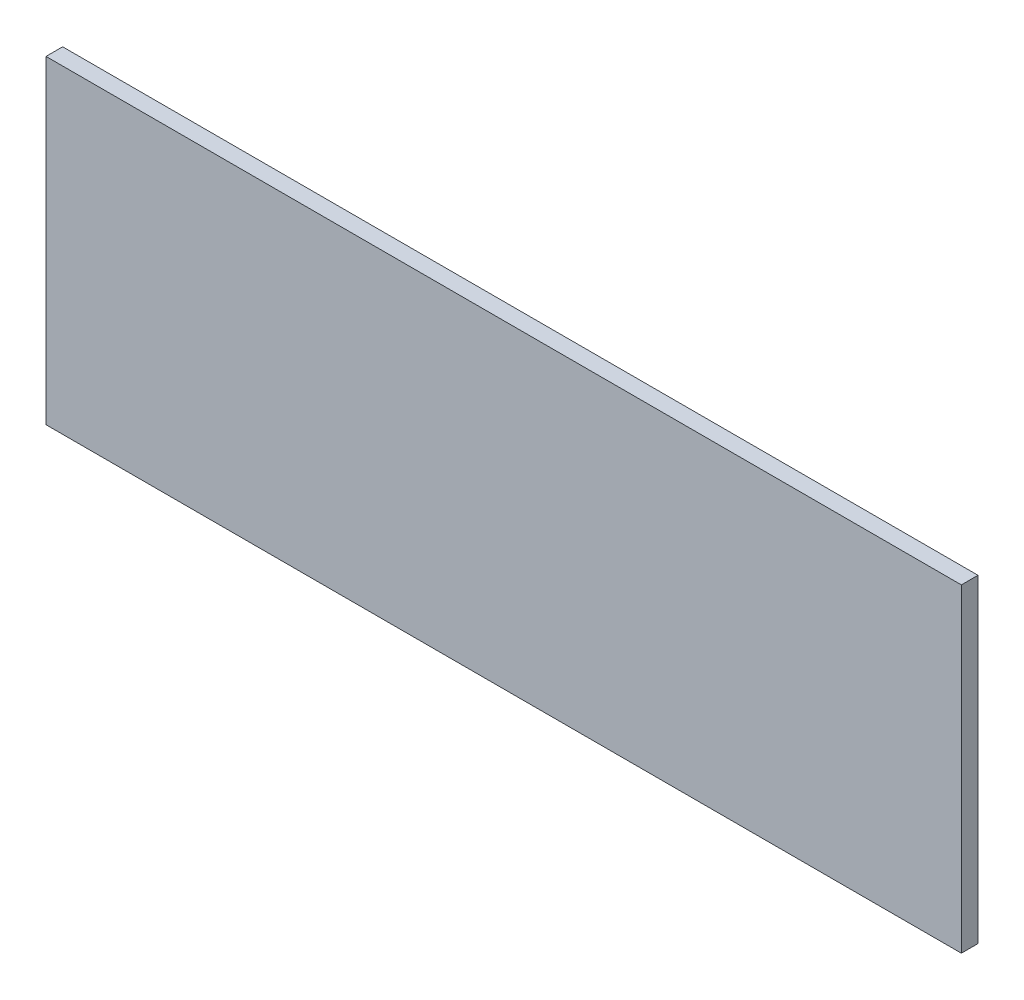
ISO-10303-21;
HEADER;
FILE_DESCRIPTION(('STEP AP214'),'2;1');
FILE_NAME('part.step','',(''),(''),'','','');
FILE_SCHEMA(('AUTOMOTIVE_DESIGN { 1 0 10303 214 1 1 1 1 }'));
ENDSEC;
DATA;
#1=APPLICATION_CONTEXT('core data for automotive mechanical design processes');
#2=APPLICATION_PROTOCOL_DEFINITION('international standard','automotive_design',2000,#1);
#3=PRODUCT_CONTEXT('',#1,'mechanical');
#4=PRODUCT('Part','Part','',(#3));
#5=PRODUCT_RELATED_PRODUCT_CATEGORY('part','',(#4));
#6=PRODUCT_DEFINITION_FORMATION('','',#4);
#7=PRODUCT_DEFINITION_CONTEXT('part definition',#1,'design');
#8=PRODUCT_DEFINITION('design','',#6,#7);
#9=PRODUCT_DEFINITION_SHAPE('','',#8);
#10=(LENGTH_UNIT() NAMED_UNIT(*) SI_UNIT(.MILLI.,.METRE.));
#11=(NAMED_UNIT(*) PLANE_ANGLE_UNIT() SI_UNIT($,.RADIAN.));
#12=(NAMED_UNIT(*) SI_UNIT($,.STERADIAN.) SOLID_ANGLE_UNIT());
#13=UNCERTAINTY_MEASURE_WITH_UNIT(LENGTH_MEASURE(1.E-05),#10,'distance_accuracy_value','');
#14=(GEOMETRIC_REPRESENTATION_CONTEXT(3) GLOBAL_UNCERTAINTY_ASSIGNED_CONTEXT((#13)) GLOBAL_UNIT_ASSIGNED_CONTEXT((#10,
#11,#12)) REPRESENTATION_CONTEXT('',''));
#15=CARTESIAN_POINT('',(0.,0.,0.));
#16=DIRECTION('',(0.,0.,1.));
#17=DIRECTION('',(1.,0.,0.));
#18=AXIS2_PLACEMENT_3D('',#15,#16,#17);
#19=CARTESIAN_POINT('',(-165.,-57.5,6.));
#20=DIRECTION('',(1.,0.,0.));
#21=DIRECTION('',(0.,0.,-1.));
#22=AXIS2_PLACEMENT_3D('',#19,#20,#21);
#23=PLANE('',#22);
#24=DIRECTION('',(0.,-1.,0.));
#25=VECTOR('',#24,1.);
#26=CARTESIAN_POINT('',(-165.,-57.5,0.));
#27=LINE('',#26,#25);
#28=CARTESIAN_POINT('',(-165.,57.5,0.));
#29=VERTEX_POINT('',#28);
#30=CARTESIAN_POINT('',(-165.,-57.5,0.));
#31=VERTEX_POINT('',#30);
#32=EDGE_CURVE('E96',#29,#31,#27,.T.);
#33=ORIENTED_EDGE('',*,*,#32,.T.);
#34=DIRECTION('',(0.,0.,-1.));
#35=VECTOR('',#34,1.);
#36=CARTESIAN_POINT('',(-165.,-57.5,6.));
#37=LINE('',#36,#35);
#38=CARTESIAN_POINT('',(-165.,-57.5,6.));
#39=VERTEX_POINT('',#38);
#40=EDGE_CURVE('E11',#39,#31,#37,.T.);
#41=ORIENTED_EDGE('',*,*,#40,.F.);
#42=DIRECTION('',(0.,-1.,0.));
#43=VECTOR('',#42,1.);
#44=CARTESIAN_POINT('',(-165.,-57.5,6.));
#45=LINE('',#44,#43);
#46=CARTESIAN_POINT('',(-165.,57.5,6.));
#47=VERTEX_POINT('',#46);
#48=EDGE_CURVE('E84',#47,#39,#45,.T.);
#49=ORIENTED_EDGE('',*,*,#48,.F.);
#50=DIRECTION('',(0.,0.,-1.));
#51=VECTOR('',#50,1.);
#52=CARTESIAN_POINT('',(-165.,57.5,6.));
#53=LINE('',#52,#51);
#54=EDGE_CURVE('E92',#47,#29,#53,.T.);
#55=ORIENTED_EDGE('',*,*,#54,.T.);
#56=EDGE_LOOP('',(#33,#41,#49,#55));
#57=FACE_BOUND('',#56,.T.);
#58=ADVANCED_FACE('F33',(#57),#23,.F.);
#59=CARTESIAN_POINT('',(165.,-57.5,6.));
#60=DIRECTION('',(0.,1.,0.));
#61=DIRECTION('',(-1.,0.,0.));
#62=AXIS2_PLACEMENT_3D('',#59,#60,#61);
#63=PLANE('',#62);
#64=DIRECTION('',(1.,0.,0.));
#65=VECTOR('',#64,1.);
#66=CARTESIAN_POINT('',(165.,-57.5,0.));
#67=LINE('',#66,#65);
#68=CARTESIAN_POINT('',(165.,-57.5,0.));
#69=VERTEX_POINT('',#68);
#70=EDGE_CURVE('E88',#31,#69,#67,.T.);
#71=ORIENTED_EDGE('',*,*,#70,.T.);
#72=DIRECTION('',(0.,0.,-1.));
#73=VECTOR('',#72,1.);
#74=CARTESIAN_POINT('',(165.,-57.5,6.));
#75=LINE('',#74,#73);
#76=CARTESIAN_POINT('',(165.,-57.5,6.));
#77=VERTEX_POINT('',#76);
#78=EDGE_CURVE('E41',#77,#69,#75,.T.);
#79=ORIENTED_EDGE('',*,*,#78,.F.);
#80=DIRECTION('',(1.,0.,0.));
#81=VECTOR('',#80,1.);
#82=CARTESIAN_POINT('',(165.,-57.5,6.));
#83=LINE('',#82,#81);
#84=EDGE_CURVE('E79',#39,#77,#83,.T.);
#85=ORIENTED_EDGE('',*,*,#84,.F.);
#86=ORIENTED_EDGE('',*,*,#40,.T.);
#87=EDGE_LOOP('',(#71,#79,#85,#86));
#88=FACE_BOUND('',#87,.T.);
#89=ADVANCED_FACE('F87',(#88),#63,.F.);
#90=CARTESIAN_POINT('',(165.,-57.5,6.));
#91=DIRECTION('',(-1.,0.,0.));
#92=DIRECTION('',(0.,0.,1.));
#93=AXIS2_PLACEMENT_3D('',#90,#91,#92);
#94=PLANE('',#93);
#95=DIRECTION('',(0.,1.,0.));
#96=VECTOR('',#95,1.);
#97=CARTESIAN_POINT('',(165.,-57.5,0.));
#98=LINE('',#97,#96);
#99=CARTESIAN_POINT('',(165.,57.5,0.));
#100=VERTEX_POINT('',#99);
#101=EDGE_CURVE('E66',#69,#100,#98,.T.);
#102=ORIENTED_EDGE('',*,*,#101,.T.);
#103=DIRECTION('',(0.,0.,-1.));
#104=VECTOR('',#103,1.);
#105=CARTESIAN_POINT('',(165.,57.5,6.));
#106=LINE('',#105,#104);
#107=CARTESIAN_POINT('',(165.,57.5,6.));
#108=VERTEX_POINT('',#107);
#109=EDGE_CURVE('E89',#108,#100,#106,.T.);
#110=ORIENTED_EDGE('',*,*,#109,.F.);
#111=DIRECTION('',(0.,1.,0.));
#112=VECTOR('',#111,1.);
#113=CARTESIAN_POINT('',(165.,-57.5,6.));
#114=LINE('',#113,#112);
#115=EDGE_CURVE('E82',#77,#108,#114,.T.);
#116=ORIENTED_EDGE('',*,*,#115,.F.);
#117=ORIENTED_EDGE('',*,*,#78,.T.);
#118=EDGE_LOOP('',(#102,#110,#116,#117));
#119=FACE_BOUND('',#118,.T.);
#120=ADVANCED_FACE('F90',(#119),#94,.F.);
#121=CARTESIAN_POINT('',(165.,57.5,6.));
#122=DIRECTION('',(0.,-1.,0.));
#123=DIRECTION('',(1.,0.,0.));
#124=AXIS2_PLACEMENT_3D('',#121,#122,#123);
#125=PLANE('',#124);
#126=DIRECTION('',(-1.,0.,0.));
#127=VECTOR('',#126,1.);
#128=CARTESIAN_POINT('',(165.,57.5,0.));
#129=LINE('',#128,#127);
#130=EDGE_CURVE('E72',#100,#29,#129,.T.);
#131=ORIENTED_EDGE('',*,*,#130,.T.);
#132=ORIENTED_EDGE('',*,*,#54,.F.);
#133=DIRECTION('',(-1.,0.,0.));
#134=VECTOR('',#133,1.);
#135=CARTESIAN_POINT('',(165.,57.5,6.));
#136=LINE('',#135,#134);
#137=EDGE_CURVE('E49',#108,#47,#136,.T.);
#138=ORIENTED_EDGE('',*,*,#137,.F.);
#139=ORIENTED_EDGE('',*,*,#109,.T.);
#140=EDGE_LOOP('',(#131,#132,#138,#139));
#141=FACE_BOUND('',#140,.T.);
#142=ADVANCED_FACE('F103',(#141),#125,.F.);
#143=CARTESIAN_POINT('',(0.,0.,6.));
#144=DIRECTION('',(0.,0.,1.));
#145=DIRECTION('',(1.,0.,0.));
#146=AXIS2_PLACEMENT_3D('',#143,#144,#145);
#147=PLANE('',#146);
#148=ORIENTED_EDGE('',*,*,#48,.T.);
#149=ORIENTED_EDGE('',*,*,#84,.T.);
#150=ORIENTED_EDGE('',*,*,#115,.T.);
#151=ORIENTED_EDGE('',*,*,#137,.T.);
#152=EDGE_LOOP('',(#148,#149,#150,#151));
#153=FACE_BOUND('',#152,.T.);
#154=ADVANCED_FACE('F80',(#153),#147,.T.);
#155=CARTESIAN_POINT('',(0.,0.,0.));
#156=DIRECTION('',(0.,0.,1.));
#157=DIRECTION('',(1.,0.,0.));
#158=AXIS2_PLACEMENT_3D('',#155,#156,#157);
#159=PLANE('',#158);
#160=ORIENTED_EDGE('',*,*,#32,.F.);
#161=ORIENTED_EDGE('',*,*,#130,.F.);
#162=ORIENTED_EDGE('',*,*,#101,.F.);
#163=ORIENTED_EDGE('',*,*,#70,.F.);
#164=EDGE_LOOP('',(#160,#161,#162,#163));
#165=FACE_BOUND('',#164,.T.);
#166=ADVANCED_FACE('F106',(#165),#159,.F.);
#167=CLOSED_SHELL('',(#58,#89,#120,#142,#154,#166));
#168=MANIFOLD_SOLID_BREP('B2',#167);
#169=ADVANCED_BREP_SHAPE_REPRESENTATION('',(#18,#168),#14);
#170=SHAPE_DEFINITION_REPRESENTATION(#9,#169);
ENDSEC;
END-ISO-10303-21;
